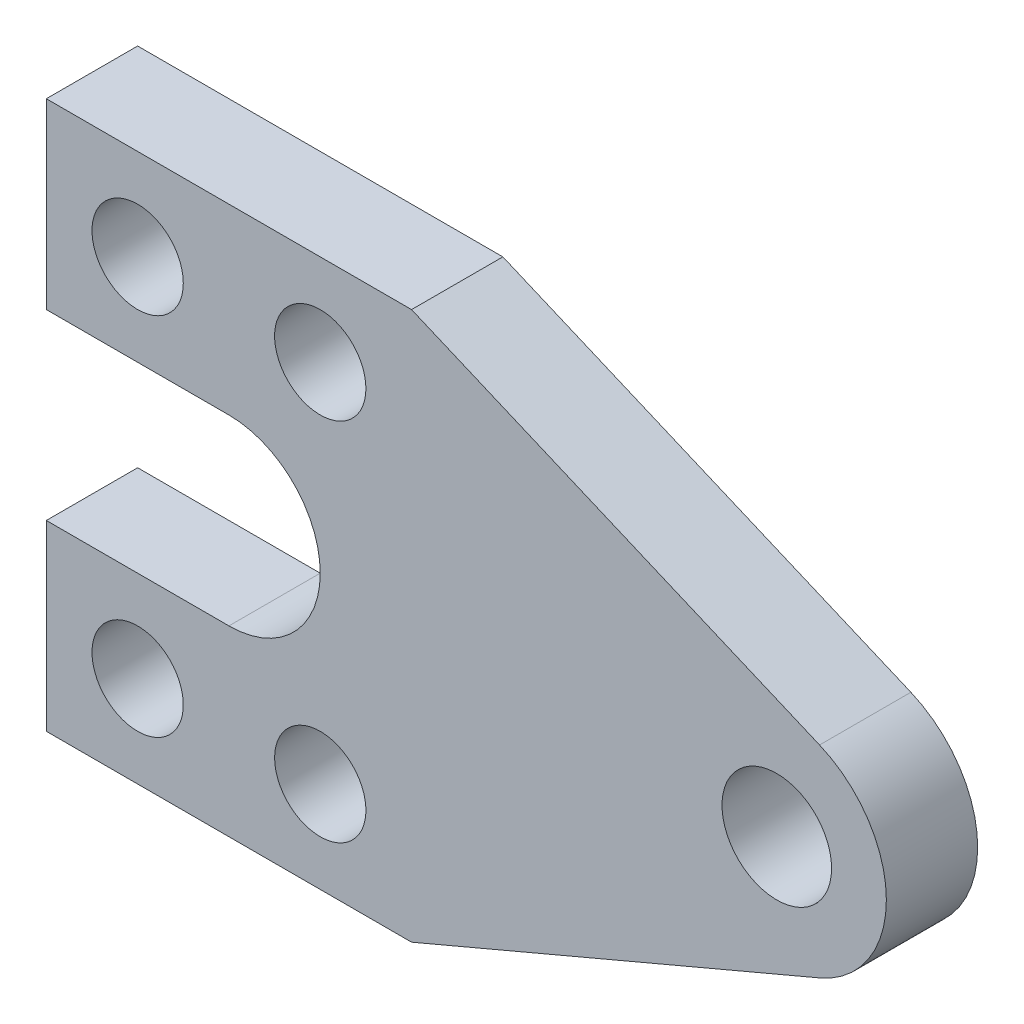
ISO-10303-21;
HEADER;
FILE_DESCRIPTION(('STEP AP214'),'2;1');
FILE_NAME('part.step','',(''),(''),'','','');
FILE_SCHEMA(('AUTOMOTIVE_DESIGN { 1 0 10303 214 1 1 1 1 }'));
ENDSEC;
DATA;
#1=APPLICATION_CONTEXT('core data for automotive mechanical design processes');
#2=APPLICATION_PROTOCOL_DEFINITION('international standard','automotive_design',2000,#1);
#3=PRODUCT_CONTEXT('',#1,'mechanical');
#4=PRODUCT('Part','Part','',(#3));
#5=PRODUCT_RELATED_PRODUCT_CATEGORY('part','',(#4));
#6=PRODUCT_DEFINITION_FORMATION('','',#4);
#7=PRODUCT_DEFINITION_CONTEXT('part definition',#1,'design');
#8=PRODUCT_DEFINITION('design','',#6,#7);
#9=PRODUCT_DEFINITION_SHAPE('','',#8);
#10=(LENGTH_UNIT() NAMED_UNIT(*) SI_UNIT(.MILLI.,.METRE.));
#11=(NAMED_UNIT(*) PLANE_ANGLE_UNIT() SI_UNIT($,.RADIAN.));
#12=(NAMED_UNIT(*) SI_UNIT($,.STERADIAN.) SOLID_ANGLE_UNIT());
#13=UNCERTAINTY_MEASURE_WITH_UNIT(LENGTH_MEASURE(1.E-05),#10,'distance_accuracy_value','');
#14=(GEOMETRIC_REPRESENTATION_CONTEXT(3) GLOBAL_UNCERTAINTY_ASSIGNED_CONTEXT((#13)) GLOBAL_UNIT_ASSIGNED_CONTEXT((#10,
#11,#12)) REPRESENTATION_CONTEXT('',''));
#15=CARTESIAN_POINT('',(0.,0.,0.));
#16=DIRECTION('',(0.,0.,1.));
#17=DIRECTION('',(1.,0.,0.));
#18=AXIS2_PLACEMENT_3D('',#15,#16,#17);
#19=CARTESIAN_POINT('',(90.,40.,10.));
#20=DIRECTION('',(0.,0.,-1.));
#21=DIRECTION('',(-1.,0.,0.));
#22=AXIS2_PLACEMENT_3D('',#19,#20,#21);
#23=PLANE('',#22);
#24=DIRECTION('',(0.,-1.,0.));
#25=VECTOR('',#24,1.);
#26=CARTESIAN_POINT('',(10.,50.,10.));
#27=LINE('',#26,#25);
#28=CARTESIAN_POINT('',(10.,70.,10.));
#29=VERTEX_POINT('',#28);
#30=CARTESIAN_POINT('',(10.,50.,10.));
#31=VERTEX_POINT('',#30);
#32=EDGE_CURVE('E165',#29,#31,#27,.T.);
#33=ORIENTED_EDGE('',*,*,#32,.T.);
#34=DIRECTION('',(1.,0.,0.));
#35=VECTOR('',#34,1.);
#36=CARTESIAN_POINT('',(30.,50.,10.));
#37=LINE('',#36,#35);
#38=CARTESIAN_POINT('',(30.,50.,10.));
#39=VERTEX_POINT('',#38);
#40=EDGE_CURVE('E103',#31,#39,#37,.T.);
#41=ORIENTED_EDGE('',*,*,#40,.T.);
#42=CARTESIAN_POINT('',(30.,40.,10.));
#43=DIRECTION('',(0.,0.,-1.));
#44=DIRECTION('',(-1.,0.,0.));
#45=AXIS2_PLACEMENT_3D('',#42,#43,#44);
#46=CIRCLE('',#45,10.);
#47=CARTESIAN_POINT('',(30.,30.,10.));
#48=VERTEX_POINT('',#47);
#49=EDGE_CURVE('E186',#39,#48,#46,.T.);
#50=ORIENTED_EDGE('',*,*,#49,.T.);
#51=DIRECTION('',(-1.,0.,0.));
#52=VECTOR('',#51,1.);
#53=CARTESIAN_POINT('',(10.,30.,10.));
#54=LINE('',#53,#52);
#55=CARTESIAN_POINT('',(10.,30.,10.));
#56=VERTEX_POINT('',#55);
#57=EDGE_CURVE('E205',#48,#56,#54,.T.);
#58=ORIENTED_EDGE('',*,*,#57,.T.);
#59=DIRECTION('',(0.,-1.,0.));
#60=VECTOR('',#59,1.);
#61=CARTESIAN_POINT('',(10.,10.,10.));
#62=LINE('',#61,#60);
#63=CARTESIAN_POINT('',(10.,10.,10.));
#64=VERTEX_POINT('',#63);
#65=EDGE_CURVE('E202',#56,#64,#62,.T.);
#66=ORIENTED_EDGE('',*,*,#65,.T.);
#67=DIRECTION('',(1.,0.,0.));
#68=VECTOR('',#67,1.);
#69=CARTESIAN_POINT('',(50.,10.,10.));
#70=LINE('',#69,#68);
#71=CARTESIAN_POINT('',(50.,10.,10.));
#72=VERTEX_POINT('',#71);
#73=EDGE_CURVE('E204',#64,#72,#70,.T.);
#74=ORIENTED_EDGE('',*,*,#73,.T.);
#75=DIRECTION('',(0.920618310368742,0.390463732776556,0.));
#76=VECTOR('',#75,1.);
#77=CARTESIAN_POINT('',(94.6855647933187,28.9525802755751,10.));
#78=LINE('',#77,#76);
#79=CARTESIAN_POINT('',(94.6855647933187,28.9525802755751,10.));
#80=VERTEX_POINT('',#79);
#81=EDGE_CURVE('E128',#72,#80,#78,.T.);
#82=ORIENTED_EDGE('',*,*,#81,.T.);
#83=CARTESIAN_POINT('',(90.,40.,10.));
#84=DIRECTION('',(0.,0.,1.));
#85=DIRECTION('',(-1.,0.,0.));
#86=AXIS2_PLACEMENT_3D('',#83,#84,#85);
#87=CIRCLE('',#86,12.);
#88=CARTESIAN_POINT('',(94.6855647933187,51.0474197244249,10.));
#89=VERTEX_POINT('',#88);
#90=EDGE_CURVE('E122',#80,#89,#87,.T.);
#91=ORIENTED_EDGE('',*,*,#90,.T.);
#92=DIRECTION('',(-0.920618310368742,0.390463732776556,0.));
#93=VECTOR('',#92,1.);
#94=CARTESIAN_POINT('',(50.,70.,10.));
#95=LINE('',#94,#93);
#96=CARTESIAN_POINT('',(50.,70.,10.));
#97=VERTEX_POINT('',#96);
#98=EDGE_CURVE('E126',#89,#97,#95,.T.);
#99=ORIENTED_EDGE('',*,*,#98,.T.);
#100=DIRECTION('',(-1.,0.,0.));
#101=VECTOR('',#100,1.);
#102=CARTESIAN_POINT('',(10.,70.,10.));
#103=LINE('',#102,#101);
#104=EDGE_CURVE('E54',#97,#29,#103,.T.);
#105=ORIENTED_EDGE('',*,*,#104,.T.);
#106=EDGE_LOOP('',(#33,#41,#50,#58,#66,#74,#82,#91,#99,#105));
#107=FACE_BOUND('',#106,.T.);
#108=CARTESIAN_POINT('',(90.,40.,10.));
#109=DIRECTION('',(0.,0.,1.));
#110=DIRECTION('',(1.,0.,0.));
#111=AXIS2_PLACEMENT_3D('',#108,#109,#110);
#112=CIRCLE('',#111,5.99999999999999);
#113=CARTESIAN_POINT('',(96.,40.,10.));
#114=VERTEX_POINT('',#113);
#115=EDGE_CURVE('E150',#114,#114,#112,.T.);
#116=ORIENTED_EDGE('',*,*,#115,.F.);
#117=EDGE_LOOP('',(#116));
#118=FACE_BOUND('',#117,.T.);
#119=CARTESIAN_POINT('',(40.,60.,10.));
#120=DIRECTION('',(0.,0.,1.));
#121=DIRECTION('',(1.,0.,0.));
#122=AXIS2_PLACEMENT_3D('',#119,#120,#121);
#123=CIRCLE('',#122,5.);
#124=CARTESIAN_POINT('',(45.,60.,10.));
#125=VERTEX_POINT('',#124);
#126=EDGE_CURVE('E216',#125,#125,#123,.T.);
#127=ORIENTED_EDGE('',*,*,#126,.F.);
#128=EDGE_LOOP('',(#127));
#129=FACE_BOUND('',#128,.T.);
#130=CARTESIAN_POINT('',(20.,60.,10.));
#131=DIRECTION('',(0.,0.,1.));
#132=DIRECTION('',(1.,0.,0.));
#133=AXIS2_PLACEMENT_3D('',#130,#131,#132);
#134=CIRCLE('',#133,5.);
#135=CARTESIAN_POINT('',(25.,60.,10.));
#136=VERTEX_POINT('',#135);
#137=EDGE_CURVE('E222',#136,#136,#134,.T.);
#138=ORIENTED_EDGE('',*,*,#137,.F.);
#139=EDGE_LOOP('',(#138));
#140=FACE_BOUND('',#139,.T.);
#141=CARTESIAN_POINT('',(40.,20.,10.));
#142=DIRECTION('',(0.,0.,1.));
#143=DIRECTION('',(-1.,0.,0.));
#144=AXIS2_PLACEMENT_3D('',#141,#142,#143);
#145=CIRCLE('',#144,5.);
#146=CARTESIAN_POINT('',(35.,20.,10.));
#147=VERTEX_POINT('',#146);
#148=EDGE_CURVE('E228',#147,#147,#145,.T.);
#149=ORIENTED_EDGE('',*,*,#148,.F.);
#150=EDGE_LOOP('',(#149));
#151=FACE_BOUND('',#150,.T.);
#152=CARTESIAN_POINT('',(20.,20.,10.));
#153=DIRECTION('',(0.,0.,1.));
#154=DIRECTION('',(-1.,0.,0.));
#155=AXIS2_PLACEMENT_3D('',#152,#153,#154);
#156=CIRCLE('',#155,5.);
#157=CARTESIAN_POINT('',(15.,20.,10.));
#158=VERTEX_POINT('',#157);
#159=EDGE_CURVE('E234',#158,#158,#156,.T.);
#160=ORIENTED_EDGE('',*,*,#159,.F.);
#161=EDGE_LOOP('',(#160));
#162=FACE_BOUND('',#161,.T.);
#163=ADVANCED_FACE('F37',(#107,#118,#129,#140,#151,#162),#23,.F.);
#164=CARTESIAN_POINT('',(90.,40.,0.));
#165=DIRECTION('',(0.,0.,-1.));
#166=DIRECTION('',(-1.,0.,0.));
#167=AXIS2_PLACEMENT_3D('',#164,#165,#166);
#168=PLANE('',#167);
#169=CARTESIAN_POINT('',(40.,20.,0.));
#170=DIRECTION('',(0.,0.,1.));
#171=DIRECTION('',(-1.,0.,0.));
#172=AXIS2_PLACEMENT_3D('',#169,#170,#171);
#173=CIRCLE('',#172,5.);
#174=CARTESIAN_POINT('',(35.,20.,0.));
#175=VERTEX_POINT('',#174);
#176=EDGE_CURVE('E231',#175,#175,#173,.T.);
#177=ORIENTED_EDGE('',*,*,#176,.T.);
#178=EDGE_LOOP('',(#177));
#179=FACE_BOUND('',#178,.T.);
#180=CARTESIAN_POINT('',(40.,60.,0.));
#181=DIRECTION('',(0.,0.,1.));
#182=DIRECTION('',(1.,0.,0.));
#183=AXIS2_PLACEMENT_3D('',#180,#181,#182);
#184=CIRCLE('',#183,5.);
#185=CARTESIAN_POINT('',(45.,60.,0.));
#186=VERTEX_POINT('',#185);
#187=EDGE_CURVE('E219',#186,#186,#184,.T.);
#188=ORIENTED_EDGE('',*,*,#187,.T.);
#189=EDGE_LOOP('',(#188));
#190=FACE_BOUND('',#189,.T.);
#191=DIRECTION('',(0.,-1.,0.));
#192=VECTOR('',#191,1.);
#193=CARTESIAN_POINT('',(10.,50.,0.));
#194=LINE('',#193,#192);
#195=CARTESIAN_POINT('',(10.,70.,0.));
#196=VERTEX_POINT('',#195);
#197=CARTESIAN_POINT('',(10.,50.,0.));
#198=VERTEX_POINT('',#197);
#199=EDGE_CURVE('E146',#196,#198,#194,.T.);
#200=ORIENTED_EDGE('',*,*,#199,.F.);
#201=DIRECTION('',(-1.,0.,0.));
#202=VECTOR('',#201,1.);
#203=CARTESIAN_POINT('',(10.,70.,0.));
#204=LINE('',#203,#202);
#205=CARTESIAN_POINT('',(50.,70.,0.));
#206=VERTEX_POINT('',#205);
#207=EDGE_CURVE('E95',#206,#196,#204,.T.);
#208=ORIENTED_EDGE('',*,*,#207,.F.);
#209=DIRECTION('',(-0.920618310368742,0.390463732776556,0.));
#210=VECTOR('',#209,1.);
#211=CARTESIAN_POINT('',(50.,70.,0.));
#212=LINE('',#211,#210);
#213=CARTESIAN_POINT('',(94.6855647933187,51.0474197244249,0.));
#214=VERTEX_POINT('',#213);
#215=EDGE_CURVE('E89',#214,#206,#212,.T.);
#216=ORIENTED_EDGE('',*,*,#215,.F.);
#217=CARTESIAN_POINT('',(90.,40.,0.));
#218=DIRECTION('',(0.,0.,1.));
#219=DIRECTION('',(-1.,0.,0.));
#220=AXIS2_PLACEMENT_3D('',#217,#218,#219);
#221=CIRCLE('',#220,12.);
#222=CARTESIAN_POINT('',(94.6855647933187,28.9525802755751,0.));
#223=VERTEX_POINT('',#222);
#224=EDGE_CURVE('E136',#223,#214,#221,.T.);
#225=ORIENTED_EDGE('',*,*,#224,.F.);
#226=DIRECTION('',(0.920618310368742,0.390463732776556,0.));
#227=VECTOR('',#226,1.);
#228=CARTESIAN_POINT('',(94.6855647933187,28.9525802755751,0.));
#229=LINE('',#228,#227);
#230=CARTESIAN_POINT('',(50.,10.,0.));
#231=VERTEX_POINT('',#230);
#232=EDGE_CURVE('E160',#231,#223,#229,.T.);
#233=ORIENTED_EDGE('',*,*,#232,.F.);
#234=DIRECTION('',(1.,0.,0.));
#235=VECTOR('',#234,1.);
#236=CARTESIAN_POINT('',(50.,10.,0.));
#237=LINE('',#236,#235);
#238=CARTESIAN_POINT('',(10.,10.,0.));
#239=VERTEX_POINT('',#238);
#240=EDGE_CURVE('E158',#239,#231,#237,.T.);
#241=ORIENTED_EDGE('',*,*,#240,.F.);
#242=DIRECTION('',(0.,-1.,0.));
#243=VECTOR('',#242,1.);
#244=CARTESIAN_POINT('',(10.,10.,0.));
#245=LINE('',#244,#243);
#246=CARTESIAN_POINT('',(10.,30.,0.));
#247=VERTEX_POINT('',#246);
#248=EDGE_CURVE('E156',#247,#239,#245,.T.);
#249=ORIENTED_EDGE('',*,*,#248,.F.);
#250=DIRECTION('',(-1.,0.,0.));
#251=VECTOR('',#250,1.);
#252=CARTESIAN_POINT('',(10.,30.,0.));
#253=LINE('',#252,#251);
#254=CARTESIAN_POINT('',(30.,30.,0.));
#255=VERTEX_POINT('',#254);
#256=EDGE_CURVE('E154',#255,#247,#253,.T.);
#257=ORIENTED_EDGE('',*,*,#256,.F.);
#258=CARTESIAN_POINT('',(30.,40.,0.));
#259=DIRECTION('',(0.,0.,-1.));
#260=DIRECTION('',(-1.,0.,0.));
#261=AXIS2_PLACEMENT_3D('',#258,#259,#260);
#262=CIRCLE('',#261,10.);
#263=CARTESIAN_POINT('',(30.,50.,0.));
#264=VERTEX_POINT('',#263);
#265=EDGE_CURVE('E152',#264,#255,#262,.T.);
#266=ORIENTED_EDGE('',*,*,#265,.F.);
#267=DIRECTION('',(1.,0.,0.));
#268=VECTOR('',#267,1.);
#269=CARTESIAN_POINT('',(30.,50.,0.));
#270=LINE('',#269,#268);
#271=EDGE_CURVE('E149',#198,#264,#270,.T.);
#272=ORIENTED_EDGE('',*,*,#271,.F.);
#273=EDGE_LOOP('',(#200,#208,#216,#225,#233,#241,#249,#257,#266,#272));
#274=FACE_BOUND('',#273,.T.);
#275=CARTESIAN_POINT('',(90.,40.,0.));
#276=DIRECTION('',(0.,0.,1.));
#277=DIRECTION('',(1.,0.,0.));
#278=AXIS2_PLACEMENT_3D('',#275,#276,#277);
#279=CIRCLE('',#278,5.99999999999999);
#280=CARTESIAN_POINT('',(96.,40.,0.));
#281=VERTEX_POINT('',#280);
#282=EDGE_CURVE('E213',#281,#281,#279,.T.);
#283=ORIENTED_EDGE('',*,*,#282,.T.);
#284=EDGE_LOOP('',(#283));
#285=FACE_BOUND('',#284,.T.);
#286=CARTESIAN_POINT('',(20.,60.,0.));
#287=DIRECTION('',(0.,0.,1.));
#288=DIRECTION('',(1.,0.,0.));
#289=AXIS2_PLACEMENT_3D('',#286,#287,#288);
#290=CIRCLE('',#289,5.);
#291=CARTESIAN_POINT('',(25.,60.,0.));
#292=VERTEX_POINT('',#291);
#293=EDGE_CURVE('E225',#292,#292,#290,.T.);
#294=ORIENTED_EDGE('',*,*,#293,.T.);
#295=EDGE_LOOP('',(#294));
#296=FACE_BOUND('',#295,.T.);
#297=CARTESIAN_POINT('',(20.,20.,0.));
#298=DIRECTION('',(0.,0.,1.));
#299=DIRECTION('',(-1.,0.,0.));
#300=AXIS2_PLACEMENT_3D('',#297,#298,#299);
#301=CIRCLE('',#300,5.);
#302=CARTESIAN_POINT('',(15.,20.,0.));
#303=VERTEX_POINT('',#302);
#304=EDGE_CURVE('E237',#303,#303,#301,.T.);
#305=ORIENTED_EDGE('',*,*,#304,.T.);
#306=EDGE_LOOP('',(#305));
#307=FACE_BOUND('',#306,.T.);
#308=ADVANCED_FACE('F190',(#179,#190,#274,#285,#296,#307),#168,.T.);
#309=CARTESIAN_POINT('',(10.,50.,10.));
#310=DIRECTION('',(1.,0.,0.));
#311=DIRECTION('',(0.,0.,-1.));
#312=AXIS2_PLACEMENT_3D('',#309,#310,#311);
#313=PLANE('',#312);
#314=ORIENTED_EDGE('',*,*,#199,.T.);
#315=DIRECTION('',(0.,0.,-1.));
#316=VECTOR('',#315,1.);
#317=CARTESIAN_POINT('',(10.,50.,10.));
#318=LINE('',#317,#316);
#319=EDGE_CURVE('E11',#31,#198,#318,.T.);
#320=ORIENTED_EDGE('',*,*,#319,.F.);
#321=ORIENTED_EDGE('',*,*,#32,.F.);
#322=DIRECTION('',(0.,0.,-1.));
#323=VECTOR('',#322,1.);
#324=CARTESIAN_POINT('',(10.,70.,10.));
#325=LINE('',#324,#323);
#326=EDGE_CURVE('E142',#29,#196,#325,.T.);
#327=ORIENTED_EDGE('',*,*,#326,.T.);
#328=EDGE_LOOP('',(#314,#320,#321,#327));
#329=FACE_BOUND('',#328,.T.);
#330=ADVANCED_FACE('F39',(#329),#313,.F.);
#331=CARTESIAN_POINT('',(30.,50.,10.));
#332=DIRECTION('',(0.,1.,0.));
#333=DIRECTION('',(0.,0.,1.));
#334=AXIS2_PLACEMENT_3D('',#331,#332,#333);
#335=PLANE('',#334);
#336=ORIENTED_EDGE('',*,*,#271,.T.);
#337=DIRECTION('',(0.,0.,-1.));
#338=VECTOR('',#337,1.);
#339=CARTESIAN_POINT('',(30.,50.,10.));
#340=LINE('',#339,#338);
#341=EDGE_CURVE('E46',#39,#264,#340,.T.);
#342=ORIENTED_EDGE('',*,*,#341,.F.);
#343=ORIENTED_EDGE('',*,*,#40,.F.);
#344=ORIENTED_EDGE('',*,*,#319,.T.);
#345=EDGE_LOOP('',(#336,#342,#343,#344));
#346=FACE_BOUND('',#345,.T.);
#347=ADVANCED_FACE('F277',(#346),#335,.F.);
#348=CARTESIAN_POINT('',(30.,40.,10.));
#349=DIRECTION('',(0.,0.,-1.));
#350=DIRECTION('',(-1.,0.,0.));
#351=AXIS2_PLACEMENT_3D('',#348,#349,#350);
#352=CYLINDRICAL_SURFACE('',#351,10.);
#353=ORIENTED_EDGE('',*,*,#265,.T.);
#354=DIRECTION('',(0.,0.,-1.));
#355=VECTOR('',#354,1.);
#356=CARTESIAN_POINT('',(30.,30.,10.));
#357=LINE('',#356,#355);
#358=EDGE_CURVE('E178',#48,#255,#357,.T.);
#359=ORIENTED_EDGE('',*,*,#358,.F.);
#360=ORIENTED_EDGE('',*,*,#49,.F.);
#361=ORIENTED_EDGE('',*,*,#341,.T.);
#362=EDGE_LOOP('',(#353,#359,#360,#361));
#363=FACE_BOUND('',#362,.T.);
#364=ADVANCED_FACE('F184',(#363),#352,.F.);
#365=CARTESIAN_POINT('',(10.,30.,10.));
#366=DIRECTION('',(0.,-1.,0.));
#367=DIRECTION('',(0.,0.,-1.));
#368=AXIS2_PLACEMENT_3D('',#365,#366,#367);
#369=PLANE('',#368);
#370=ORIENTED_EDGE('',*,*,#256,.T.);
#371=DIRECTION('',(0.,0.,-1.));
#372=VECTOR('',#371,1.);
#373=CARTESIAN_POINT('',(10.,30.,10.));
#374=LINE('',#373,#372);
#375=EDGE_CURVE('E175',#56,#247,#374,.T.);
#376=ORIENTED_EDGE('',*,*,#375,.F.);
#377=ORIENTED_EDGE('',*,*,#57,.F.);
#378=ORIENTED_EDGE('',*,*,#358,.T.);
#379=EDGE_LOOP('',(#370,#376,#377,#378));
#380=FACE_BOUND('',#379,.T.);
#381=ADVANCED_FACE('F196',(#380),#369,.F.);
#382=CARTESIAN_POINT('',(10.,10.,10.));
#383=DIRECTION('',(1.,0.,0.));
#384=DIRECTION('',(0.,1.,0.));
#385=AXIS2_PLACEMENT_3D('',#382,#383,#384);
#386=PLANE('',#385);
#387=ORIENTED_EDGE('',*,*,#248,.T.);
#388=DIRECTION('',(0.,0.,-1.));
#389=VECTOR('',#388,1.);
#390=CARTESIAN_POINT('',(10.,10.,10.));
#391=LINE('',#390,#389);
#392=EDGE_CURVE('E172',#64,#239,#391,.T.);
#393=ORIENTED_EDGE('',*,*,#392,.F.);
#394=ORIENTED_EDGE('',*,*,#65,.F.);
#395=ORIENTED_EDGE('',*,*,#375,.T.);
#396=EDGE_LOOP('',(#387,#393,#394,#395));
#397=FACE_BOUND('',#396,.T.);
#398=ADVANCED_FACE('F200',(#397),#386,.F.);
#399=CARTESIAN_POINT('',(50.,10.,10.));
#400=DIRECTION('',(0.,1.,0.));
#401=DIRECTION('',(-1.,0.,0.));
#402=AXIS2_PLACEMENT_3D('',#399,#400,#401);
#403=PLANE('',#402);
#404=ORIENTED_EDGE('',*,*,#240,.T.);
#405=DIRECTION('',(0.,0.,-1.));
#406=VECTOR('',#405,1.);
#407=CARTESIAN_POINT('',(50.,10.,10.));
#408=LINE('',#407,#406);
#409=EDGE_CURVE('E169',#72,#231,#408,.T.);
#410=ORIENTED_EDGE('',*,*,#409,.F.);
#411=ORIENTED_EDGE('',*,*,#73,.F.);
#412=ORIENTED_EDGE('',*,*,#392,.T.);
#413=EDGE_LOOP('',(#404,#410,#411,#412));
#414=FACE_BOUND('',#413,.T.);
#415=ADVANCED_FACE('F267',(#414),#403,.F.);
#416=CARTESIAN_POINT('',(94.6855647933187,28.9525802755751,10.));
#417=DIRECTION('',(-0.390463732776556,0.920618310368742,0.));
#418=DIRECTION('',(-0.920618310368742,-0.390463732776556,0.));
#419=AXIS2_PLACEMENT_3D('',#416,#417,#418);
#420=PLANE('',#419);
#421=ORIENTED_EDGE('',*,*,#232,.T.);
#422=DIRECTION('',(0.,0.,-1.));
#423=VECTOR('',#422,1.);
#424=CARTESIAN_POINT('',(94.6855647933187,28.9525802755751,10.));
#425=LINE('',#424,#423);
#426=EDGE_CURVE('E137',#80,#223,#425,.T.);
#427=ORIENTED_EDGE('',*,*,#426,.F.);
#428=ORIENTED_EDGE('',*,*,#81,.F.);
#429=ORIENTED_EDGE('',*,*,#409,.T.);
#430=EDGE_LOOP('',(#421,#427,#428,#429));
#431=FACE_BOUND('',#430,.T.);
#432=ADVANCED_FACE('F264',(#431),#420,.F.);
#433=CARTESIAN_POINT('',(90.,40.,10.));
#434=DIRECTION('',(0.,0.,-1.));
#435=DIRECTION('',(-1.,0.,0.));
#436=AXIS2_PLACEMENT_3D('',#433,#434,#435);
#437=CYLINDRICAL_SURFACE('',#436,12.);
#438=ORIENTED_EDGE('',*,*,#224,.T.);
#439=DIRECTION('',(0.,0.,-1.));
#440=VECTOR('',#439,1.);
#441=CARTESIAN_POINT('',(94.6855647933187,51.0474197244249,10.));
#442=LINE('',#441,#440);
#443=EDGE_CURVE('E133',#89,#214,#442,.T.);
#444=ORIENTED_EDGE('',*,*,#443,.F.);
#445=ORIENTED_EDGE('',*,*,#90,.F.);
#446=ORIENTED_EDGE('',*,*,#426,.T.);
#447=EDGE_LOOP('',(#438,#444,#445,#446));
#448=FACE_BOUND('',#447,.T.);
#449=ADVANCED_FACE('F134',(#448),#437,.T.);
#450=CARTESIAN_POINT('',(50.,70.,10.));
#451=DIRECTION('',(-0.390463732776556,-0.920618310368742,0.));
#452=DIRECTION('',(0.920618310368742,-0.390463732776556,0.));
#453=AXIS2_PLACEMENT_3D('',#450,#451,#452);
#454=PLANE('',#453);
#455=ORIENTED_EDGE('',*,*,#215,.T.);
#456=DIRECTION('',(0.,0.,-1.));
#457=VECTOR('',#456,1.);
#458=CARTESIAN_POINT('',(50.,70.,10.));
#459=LINE('',#458,#457);
#460=EDGE_CURVE('E138',#97,#206,#459,.T.);
#461=ORIENTED_EDGE('',*,*,#460,.F.);
#462=ORIENTED_EDGE('',*,*,#98,.F.);
#463=ORIENTED_EDGE('',*,*,#443,.T.);
#464=EDGE_LOOP('',(#455,#461,#462,#463));
#465=FACE_BOUND('',#464,.T.);
#466=ADVANCED_FACE('F140',(#465),#454,.F.);
#467=CARTESIAN_POINT('',(10.,70.,10.));
#468=DIRECTION('',(0.,-1.,0.));
#469=DIRECTION('',(0.,0.,-1.));
#470=AXIS2_PLACEMENT_3D('',#467,#468,#469);
#471=PLANE('',#470);
#472=ORIENTED_EDGE('',*,*,#207,.T.);
#473=ORIENTED_EDGE('',*,*,#326,.F.);
#474=ORIENTED_EDGE('',*,*,#104,.F.);
#475=ORIENTED_EDGE('',*,*,#460,.T.);
#476=EDGE_LOOP('',(#472,#473,#474,#475));
#477=FACE_BOUND('',#476,.T.);
#478=ADVANCED_FACE('F257',(#477),#471,.F.);
#479=CARTESIAN_POINT('',(90.,40.,10.));
#480=DIRECTION('',(0.,0.,-1.));
#481=DIRECTION('',(-1.,0.,0.));
#482=AXIS2_PLACEMENT_3D('',#479,#480,#481);
#483=CYLINDRICAL_SURFACE('',#482,5.99999999999999);
#484=ORIENTED_EDGE('',*,*,#115,.T.);
#485=EDGE_LOOP('',(#484));
#486=FACE_BOUND('',#485,.T.);
#487=ORIENTED_EDGE('',*,*,#282,.F.);
#488=EDGE_LOOP('',(#487));
#489=FACE_BOUND('',#488,.T.);
#490=ADVANCED_FACE('F254',(#486,#489),#483,.F.);
#491=CARTESIAN_POINT('',(40.,60.,10.));
#492=DIRECTION('',(0.,0.,-1.));
#493=DIRECTION('',(-1.,0.,0.));
#494=AXIS2_PLACEMENT_3D('',#491,#492,#493);
#495=CYLINDRICAL_SURFACE('',#494,5.);
#496=ORIENTED_EDGE('',*,*,#126,.T.);
#497=EDGE_LOOP('',(#496));
#498=FACE_BOUND('',#497,.T.);
#499=ORIENTED_EDGE('',*,*,#187,.F.);
#500=EDGE_LOOP('',(#499));
#501=FACE_BOUND('',#500,.T.);
#502=ADVANCED_FACE('F367',(#498,#501),#495,.F.);
#503=CARTESIAN_POINT('',(20.,60.,10.));
#504=DIRECTION('',(0.,0.,-1.));
#505=DIRECTION('',(-1.,0.,0.));
#506=AXIS2_PLACEMENT_3D('',#503,#504,#505);
#507=CYLINDRICAL_SURFACE('',#506,5.);
#508=ORIENTED_EDGE('',*,*,#137,.T.);
#509=EDGE_LOOP('',(#508));
#510=FACE_BOUND('',#509,.T.);
#511=ORIENTED_EDGE('',*,*,#293,.F.);
#512=EDGE_LOOP('',(#511));
#513=FACE_BOUND('',#512,.T.);
#514=ADVANCED_FACE('F376',(#510,#513),#507,.F.);
#515=CARTESIAN_POINT('',(40.,20.,10.));
#516=DIRECTION('',(0.,0.,-1.));
#517=DIRECTION('',(-1.,0.,0.));
#518=AXIS2_PLACEMENT_3D('',#515,#516,#517);
#519=CYLINDRICAL_SURFACE('',#518,5.);
#520=ORIENTED_EDGE('',*,*,#148,.T.);
#521=EDGE_LOOP('',(#520));
#522=FACE_BOUND('',#521,.T.);
#523=ORIENTED_EDGE('',*,*,#176,.F.);
#524=EDGE_LOOP('',(#523));
#525=FACE_BOUND('',#524,.T.);
#526=ADVANCED_FACE('F385',(#522,#525),#519,.F.);
#527=CARTESIAN_POINT('',(20.,20.,10.));
#528=DIRECTION('',(0.,0.,-1.));
#529=DIRECTION('',(-1.,0.,0.));
#530=AXIS2_PLACEMENT_3D('',#527,#528,#529);
#531=CYLINDRICAL_SURFACE('',#530,5.);
#532=ORIENTED_EDGE('',*,*,#159,.T.);
#533=EDGE_LOOP('',(#532));
#534=FACE_BOUND('',#533,.T.);
#535=ORIENTED_EDGE('',*,*,#304,.F.);
#536=EDGE_LOOP('',(#535));
#537=FACE_BOUND('',#536,.T.);
#538=ADVANCED_FACE('F243',(#534,#537),#531,.F.);
#539=CLOSED_SHELL('',(#163,#308,#330,#347,#364,#381,#398,#415,#432,#449,#466,#478,#490,#502,
#514,#526,#538));
#540=MANIFOLD_SOLID_BREP('B2',#539);
#541=ADVANCED_BREP_SHAPE_REPRESENTATION('',(#18,#540),#14);
#542=SHAPE_DEFINITION_REPRESENTATION(#9,#541);
ENDSEC;
END-ISO-10303-21;
